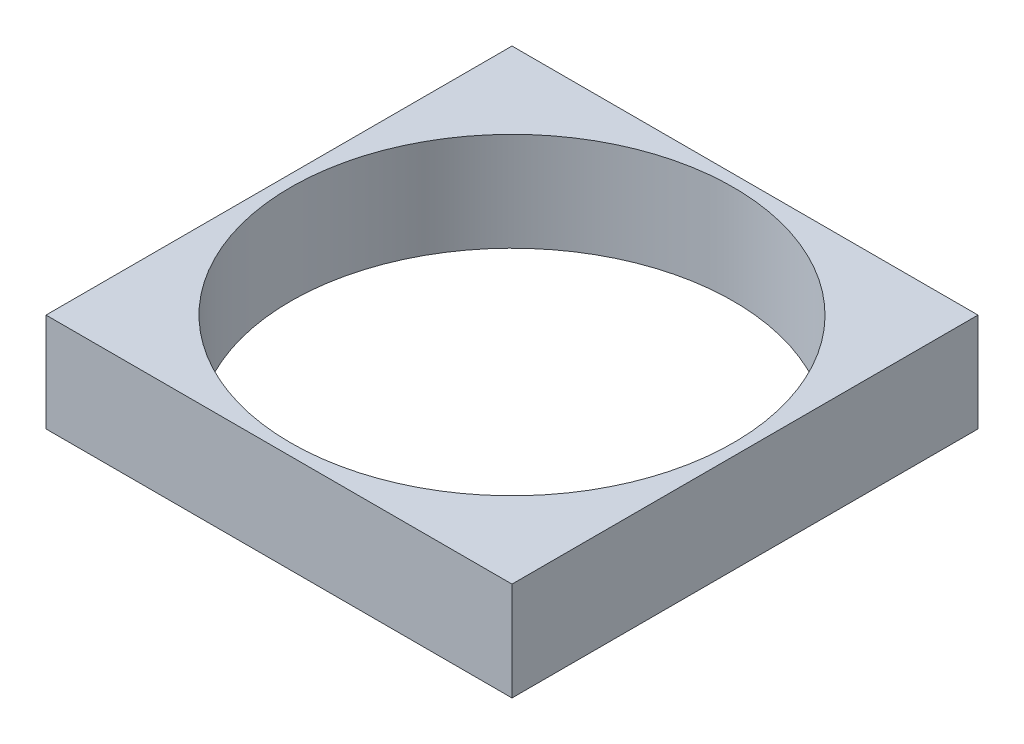
ISO-10303-21;
HEADER;
FILE_DESCRIPTION(('STEP AP214'),'2;1');
FILE_NAME('part.step','',(''),(''),'','','');
FILE_SCHEMA(('AUTOMOTIVE_DESIGN { 1 0 10303 214 1 1 1 1 }'));
ENDSEC;
DATA;
#1=APPLICATION_CONTEXT('core data for automotive mechanical design processes');
#2=APPLICATION_PROTOCOL_DEFINITION('international standard','automotive_design',2000,#1);
#3=PRODUCT_CONTEXT('',#1,'mechanical');
#4=PRODUCT('Part','Part','',(#3));
#5=PRODUCT_RELATED_PRODUCT_CATEGORY('part','',(#4));
#6=PRODUCT_DEFINITION_FORMATION('','',#4);
#7=PRODUCT_DEFINITION_CONTEXT('part definition',#1,'design');
#8=PRODUCT_DEFINITION('design','',#6,#7);
#9=PRODUCT_DEFINITION_SHAPE('','',#8);
#10=(LENGTH_UNIT() NAMED_UNIT(*) SI_UNIT(.MILLI.,.METRE.));
#11=(NAMED_UNIT(*) PLANE_ANGLE_UNIT() SI_UNIT($,.RADIAN.));
#12=(NAMED_UNIT(*) SI_UNIT($,.STERADIAN.) SOLID_ANGLE_UNIT());
#13=UNCERTAINTY_MEASURE_WITH_UNIT(LENGTH_MEASURE(1.E-05),#10,'distance_accuracy_value','');
#14=(GEOMETRIC_REPRESENTATION_CONTEXT(3) GLOBAL_UNCERTAINTY_ASSIGNED_CONTEXT((#13)) GLOBAL_UNIT_ASSIGNED_CONTEXT((#10,
#11,#12)) REPRESENTATION_CONTEXT('',''));
#15=CARTESIAN_POINT('',(0.,0.,0.));
#16=DIRECTION('',(0.,0.,1.));
#17=DIRECTION('',(1.,0.,0.));
#18=AXIS2_PLACEMENT_3D('',#15,#16,#17);
#19=CARTESIAN_POINT('',(0.,25.4,0.));
#20=DIRECTION('',(0.,-1.,0.));
#21=DIRECTION('',(0.,0.,-1.));
#22=AXIS2_PLACEMENT_3D('',#19,#20,#21);
#23=PLANE('',#22);
#24=DIRECTION('',(0.,0.,-1.));
#25=VECTOR('',#24,1.);
#26=CARTESIAN_POINT('',(60.,25.4,60.));
#27=LINE('',#26,#25);
#28=CARTESIAN_POINT('',(60.,25.4,60.));
#29=VERTEX_POINT('',#28);
#30=CARTESIAN_POINT('',(60.,25.4,-60.));
#31=VERTEX_POINT('',#30);
#32=EDGE_CURVE('E91',#29,#31,#27,.T.);
#33=ORIENTED_EDGE('',*,*,#32,.T.);
#34=DIRECTION('',(-1.,0.,0.));
#35=VECTOR('',#34,1.);
#36=CARTESIAN_POINT('',(-60.,25.4,-60.));
#37=LINE('',#36,#35);
#38=CARTESIAN_POINT('',(-60.,25.4,-60.));
#39=VERTEX_POINT('',#38);
#40=EDGE_CURVE('E86',#31,#39,#37,.T.);
#41=ORIENTED_EDGE('',*,*,#40,.T.);
#42=DIRECTION('',(0.,0.,1.));
#43=VECTOR('',#42,1.);
#44=CARTESIAN_POINT('',(-60.,25.4,60.));
#45=LINE('',#44,#43);
#46=CARTESIAN_POINT('',(-60.,25.4,60.));
#47=VERTEX_POINT('',#46);
#48=EDGE_CURVE('E93',#39,#47,#45,.T.);
#49=ORIENTED_EDGE('',*,*,#48,.T.);
#50=DIRECTION('',(1.,0.,0.));
#51=VECTOR('',#50,1.);
#52=CARTESIAN_POINT('',(-60.,25.4,60.));
#53=LINE('',#52,#51);
#54=EDGE_CURVE('E59',#47,#29,#53,.T.);
#55=ORIENTED_EDGE('',*,*,#54,.T.);
#56=EDGE_LOOP('',(#33,#41,#49,#55));
#57=FACE_BOUND('',#56,.T.);
#58=CARTESIAN_POINT('',(0.,25.4,0.));
#59=DIRECTION('',(0.,1.,0.));
#60=DIRECTION('',(0.,0.,1.));
#61=AXIS2_PLACEMENT_3D('',#58,#59,#60);
#62=CIRCLE('',#61,57.);
#63=CARTESIAN_POINT('',(0.,25.4,57.));
#64=VERTEX_POINT('',#63);
#65=EDGE_CURVE('E107',#64,#64,#62,.T.);
#66=ORIENTED_EDGE('',*,*,#65,.F.);
#67=EDGE_LOOP('',(#66));
#68=FACE_BOUND('',#67,.T.);
#69=ADVANCED_FACE('F41',(#57,#68),#23,.F.);
#70=CARTESIAN_POINT('',(0.,0.,0.));
#71=DIRECTION('',(0.,-1.,0.));
#72=DIRECTION('',(0.,0.,-1.));
#73=AXIS2_PLACEMENT_3D('',#70,#71,#72);
#74=PLANE('',#73);
#75=DIRECTION('',(0.,0.,-1.));
#76=VECTOR('',#75,1.);
#77=CARTESIAN_POINT('',(60.,0.,60.));
#78=LINE('',#77,#76);
#79=CARTESIAN_POINT('',(60.,0.,60.));
#80=VERTEX_POINT('',#79);
#81=CARTESIAN_POINT('',(60.,0.,-60.));
#82=VERTEX_POINT('',#81);
#83=EDGE_CURVE('E104',#80,#82,#78,.T.);
#84=ORIENTED_EDGE('',*,*,#83,.F.);
#85=DIRECTION('',(1.,0.,0.));
#86=VECTOR('',#85,1.);
#87=CARTESIAN_POINT('',(-60.,0.,60.));
#88=LINE('',#87,#86);
#89=CARTESIAN_POINT('',(-60.,0.,60.));
#90=VERTEX_POINT('',#89);
#91=EDGE_CURVE('E82',#90,#80,#88,.T.);
#92=ORIENTED_EDGE('',*,*,#91,.F.);
#93=DIRECTION('',(0.,0.,1.));
#94=VECTOR('',#93,1.);
#95=CARTESIAN_POINT('',(-60.,0.,60.));
#96=LINE('',#95,#94);
#97=CARTESIAN_POINT('',(-60.,0.,-60.));
#98=VERTEX_POINT('',#97);
#99=EDGE_CURVE('E73',#98,#90,#96,.T.);
#100=ORIENTED_EDGE('',*,*,#99,.F.);
#101=DIRECTION('',(-1.,0.,0.));
#102=VECTOR('',#101,1.);
#103=CARTESIAN_POINT('',(-60.,0.,-60.));
#104=LINE('',#103,#102);
#105=EDGE_CURVE('E100',#82,#98,#104,.T.);
#106=ORIENTED_EDGE('',*,*,#105,.F.);
#107=EDGE_LOOP('',(#84,#92,#100,#106));
#108=FACE_BOUND('',#107,.T.);
#109=CARTESIAN_POINT('',(0.,0.,0.));
#110=DIRECTION('',(0.,1.,0.));
#111=DIRECTION('',(0.,0.,1.));
#112=AXIS2_PLACEMENT_3D('',#109,#110,#111);
#113=CIRCLE('',#112,57.);
#114=CARTESIAN_POINT('',(0.,0.,57.));
#115=VERTEX_POINT('',#114);
#116=EDGE_CURVE('E118',#115,#115,#113,.T.);
#117=ORIENTED_EDGE('',*,*,#116,.T.);
#118=EDGE_LOOP('',(#117));
#119=FACE_BOUND('',#118,.T.);
#120=ADVANCED_FACE('F117',(#108,#119),#74,.T.);
#121=CARTESIAN_POINT('',(60.,25.4,60.));
#122=DIRECTION('',(-1.,0.,0.));
#123=DIRECTION('',(0.,0.,1.));
#124=AXIS2_PLACEMENT_3D('',#121,#122,#123);
#125=PLANE('',#124);
#126=ORIENTED_EDGE('',*,*,#83,.T.);
#127=DIRECTION('',(0.,-1.,0.));
#128=VECTOR('',#127,1.);
#129=CARTESIAN_POINT('',(60.,25.4,-60.));
#130=LINE('',#129,#128);
#131=EDGE_CURVE('E11',#31,#82,#130,.T.);
#132=ORIENTED_EDGE('',*,*,#131,.F.);
#133=ORIENTED_EDGE('',*,*,#32,.F.);
#134=DIRECTION('',(0.,-1.,0.));
#135=VECTOR('',#134,1.);
#136=CARTESIAN_POINT('',(60.,25.4,60.));
#137=LINE('',#136,#135);
#138=EDGE_CURVE('E101',#29,#80,#137,.T.);
#139=ORIENTED_EDGE('',*,*,#138,.T.);
#140=EDGE_LOOP('',(#126,#132,#133,#139));
#141=FACE_BOUND('',#140,.T.);
#142=ADVANCED_FACE('F43',(#141),#125,.F.);
#143=CARTESIAN_POINT('',(-60.,25.4,-60.));
#144=DIRECTION('',(0.,0.,1.));
#145=DIRECTION('',(1.,0.,0.));
#146=AXIS2_PLACEMENT_3D('',#143,#144,#145);
#147=PLANE('',#146);
#148=ORIENTED_EDGE('',*,*,#105,.T.);
#149=DIRECTION('',(0.,-1.,0.));
#150=VECTOR('',#149,1.);
#151=CARTESIAN_POINT('',(-60.,25.4,-60.));
#152=LINE('',#151,#150);
#153=EDGE_CURVE('E49',#39,#98,#152,.T.);
#154=ORIENTED_EDGE('',*,*,#153,.F.);
#155=ORIENTED_EDGE('',*,*,#40,.F.);
#156=ORIENTED_EDGE('',*,*,#131,.T.);
#157=EDGE_LOOP('',(#148,#154,#155,#156));
#158=FACE_BOUND('',#157,.T.);
#159=ADVANCED_FACE('F96',(#158),#147,.F.);
#160=CARTESIAN_POINT('',(-60.,25.4,60.));
#161=DIRECTION('',(1.,0.,0.));
#162=DIRECTION('',(0.,0.,-1.));
#163=AXIS2_PLACEMENT_3D('',#160,#161,#162);
#164=PLANE('',#163);
#165=ORIENTED_EDGE('',*,*,#99,.T.);
#166=DIRECTION('',(0.,-1.,0.));
#167=VECTOR('',#166,1.);
#168=CARTESIAN_POINT('',(-60.,25.4,60.));
#169=LINE('',#168,#167);
#170=EDGE_CURVE('E98',#47,#90,#169,.T.);
#171=ORIENTED_EDGE('',*,*,#170,.F.);
#172=ORIENTED_EDGE('',*,*,#48,.F.);
#173=ORIENTED_EDGE('',*,*,#153,.T.);
#174=EDGE_LOOP('',(#165,#171,#172,#173));
#175=FACE_BOUND('',#174,.T.);
#176=ADVANCED_FACE('F97',(#175),#164,.F.);
#177=CARTESIAN_POINT('',(-60.,25.4,60.));
#178=DIRECTION('',(0.,0.,-1.));
#179=DIRECTION('',(-1.,0.,0.));
#180=AXIS2_PLACEMENT_3D('',#177,#178,#179);
#181=PLANE('',#180);
#182=ORIENTED_EDGE('',*,*,#91,.T.);
#183=ORIENTED_EDGE('',*,*,#138,.F.);
#184=ORIENTED_EDGE('',*,*,#54,.F.);
#185=ORIENTED_EDGE('',*,*,#170,.T.);
#186=EDGE_LOOP('',(#182,#183,#184,#185));
#187=FACE_BOUND('',#186,.T.);
#188=ADVANCED_FACE('F114',(#187),#181,.F.);
#189=CARTESIAN_POINT('',(0.,25.4,0.));
#190=DIRECTION('',(0.,-1.,0.));
#191=DIRECTION('',(0.,0.,-1.));
#192=AXIS2_PLACEMENT_3D('',#189,#190,#191);
#193=CYLINDRICAL_SURFACE('',#192,57.);
#194=ORIENTED_EDGE('',*,*,#65,.T.);
#195=EDGE_LOOP('',(#194));
#196=FACE_BOUND('',#195,.T.);
#197=ORIENTED_EDGE('',*,*,#116,.F.);
#198=EDGE_LOOP('',(#197));
#199=FACE_BOUND('',#198,.T.);
#200=ADVANCED_FACE('F127',(#196,#199),#193,.F.);
#201=CLOSED_SHELL('',(#69,#120,#142,#159,#176,#188,#200));
#202=MANIFOLD_SOLID_BREP('B2',#201);
#203=ADVANCED_BREP_SHAPE_REPRESENTATION('',(#18,#202),#14);
#204=SHAPE_DEFINITION_REPRESENTATION(#9,#203);
ENDSEC;
END-ISO-10303-21;
